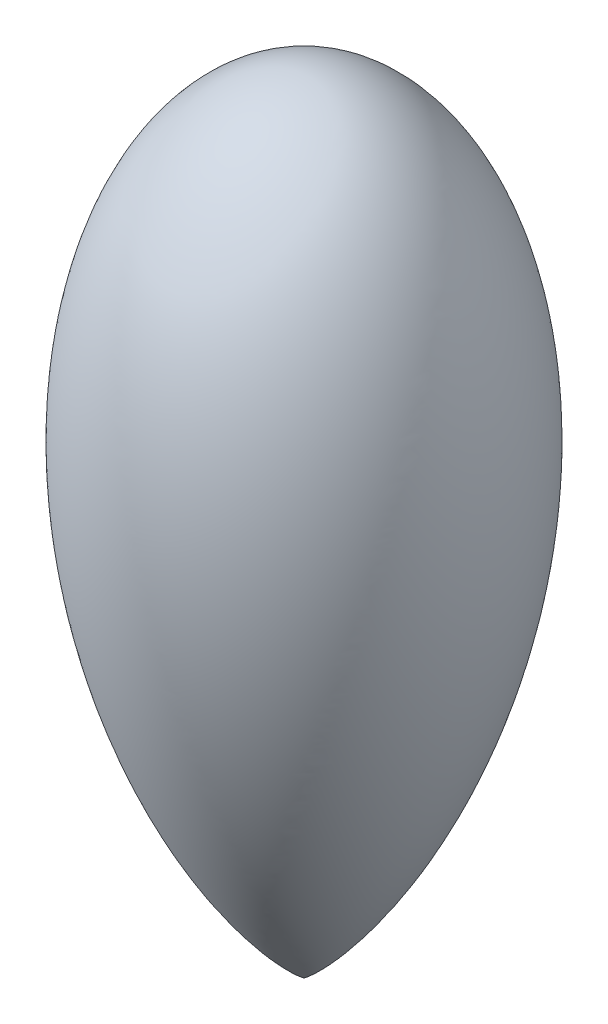
ISO-10303-21;
HEADER;
FILE_DESCRIPTION(('STEP AP214'),'2;1');
FILE_NAME('part.step','',(''),(''),'','','');
FILE_SCHEMA(('AUTOMOTIVE_DESIGN { 1 0 10303 214 1 1 1 1 }'));
ENDSEC;
DATA;
#1=APPLICATION_CONTEXT('core data for automotive mechanical design processes');
#2=APPLICATION_PROTOCOL_DEFINITION('international standard','automotive_design',2000,#1);
#3=PRODUCT_CONTEXT('',#1,'mechanical');
#4=PRODUCT('Part','Part','',(#3));
#5=PRODUCT_RELATED_PRODUCT_CATEGORY('part','',(#4));
#6=PRODUCT_DEFINITION_FORMATION('','',#4);
#7=PRODUCT_DEFINITION_CONTEXT('part definition',#1,'design');
#8=PRODUCT_DEFINITION('design','',#6,#7);
#9=PRODUCT_DEFINITION_SHAPE('','',#8);
#10=(LENGTH_UNIT() NAMED_UNIT(*) SI_UNIT(.MILLI.,.METRE.));
#11=(NAMED_UNIT(*) PLANE_ANGLE_UNIT() SI_UNIT($,.RADIAN.));
#12=(NAMED_UNIT(*) SI_UNIT($,.STERADIAN.) SOLID_ANGLE_UNIT());
#13=UNCERTAINTY_MEASURE_WITH_UNIT(LENGTH_MEASURE(1.E-05),#10,'distance_accuracy_value','');
#14=(GEOMETRIC_REPRESENTATION_CONTEXT(3) GLOBAL_UNCERTAINTY_ASSIGNED_CONTEXT((#13)) GLOBAL_UNIT_ASSIGNED_CONTEXT((#10,
#11,#12)) REPRESENTATION_CONTEXT('',''));
#15=CARTESIAN_POINT('',(0.,0.,0.));
#16=DIRECTION('',(0.,0.,1.));
#17=DIRECTION('',(1.,0.,0.));
#18=AXIS2_PLACEMENT_3D('',#15,#16,#17);
#19=CARTESIAN_POINT('',(-2.02926264296774E-10,0.,0.));
#20=CARTESIAN_POINT('',(0.0717853702311734,0.0518540831576657,0.));
#21=CARTESIAN_POINT('',(0.214574658402708,0.156617176103664,0.));
#22=CARTESIAN_POINT('',(0.496950104184648,0.370472015656567,0.));
#23=CARTESIAN_POINT('',(1.05480117848832,0.807143191290645,0.));
#24=CARTESIAN_POINT('',(1.80993147111071,1.42253628754725,0.));
#25=CARTESIAN_POINT('',(2.75517558960353,2.22478092115772,0.));
#26=CARTESIAN_POINT('',(3.8179713715169,3.16179624411655,0.));
#27=CARTESIAN_POINT('',(4.86569385934361,4.11560903109981,0.));
#28=CARTESIAN_POINT('',(6.15846404705854,5.32614344579271,0.));
#29=CARTESIAN_POINT('',(7.73540123757646,6.85358925528498,0.));
#30=CARTESIAN_POINT('',(9.58158547287812,8.7122951681977,0.));
#31=CARTESIAN_POINT('',(11.6812615677432,10.9162868547804,0.));
#32=CARTESIAN_POINT('',(13.7853327582307,13.2120301004228,0.));
#33=CARTESIAN_POINT('',(16.3642335694762,16.1277597760601,0.));
#34=CARTESIAN_POINT('',(19.3817550662069,19.6936952107332,0.));
#35=CARTESIAN_POINT('',(22.9872803470232,24.175892530292,0.));
#36=CARTESIAN_POINT('',(27.1151224994141,29.6215039572647,0.));
#37=CARTESIAN_POINT('',(31.264471127031,35.4266337046961,0.));
#38=CARTESIAN_POINT('',(35.421520285346,41.5942284832149,0.));
#39=CARTESIAN_POINT('',(40.4166553362054,49.4354410446972,0.));
#40=CARTESIAN_POINT('',(46.1001905212503,59.0372397139515,0.));
#41=CARTESIAN_POINT('',(52.2970359402469,70.4866573089005,0.));
#42=CARTESIAN_POINT('',(58.806049892909,83.8654816794686,0.));
#43=CARTESIAN_POINT('',(64.7556363946668,97.5019901994042,0.));
#44=CARTESIAN_POINT('',(70.1533065932443,111.365996188055,0.));
#45=CARTESIAN_POINT('',(76.2138237634696,128.947781241798,0.));
#46=CARTESIAN_POINT('',(82.3851329356026,150.401479659337,0.));
#47=CARTESIAN_POINT('',(87.9565612696462,175.85445307802,0.));
#48=CARTESIAN_POINT('',(91.4893188724422,201.671593696003,0.));
#49=CARTESIAN_POINT('',(92.9633174753603,223.95019677703,0.));
#50=CARTESIAN_POINT('',(93.0831763057516,242.548610516012,0.));
#51=CARTESIAN_POINT('',(92.4788453526525,257.415887104169,0.));
#52=CARTESIAN_POINT('',(91.1324436504385,272.235269983792,0.));
#53=CARTESIAN_POINT('',(89.2609362308563,285.121341877209,0.));
#54=CARTESIAN_POINT('',(87.1237346026261,296.074187207267,0.));
#55=CARTESIAN_POINT('',(84.9645651868758,305.117720973332,0.));
#56=CARTESIAN_POINT('',(83.0002977932717,312.291991964506,0.));
#57=CARTESIAN_POINT('',(80.7880905592931,319.393915411633,0.));
#58=CARTESIAN_POINT('',(78.3158651569219,326.40978055237,0.));
#59=CARTESIAN_POINT('',(75.4437924694911,333.642399047453,0.));
#60=CARTESIAN_POINT('',(72.1115926642654,341.053624009429,0.));
#61=CARTESIAN_POINT('',(68.4055952646716,348.286566977112,0.));
#62=CARTESIAN_POINT('',(64.3010869279958,355.301256014537,0.));
#63=CARTESIAN_POINT('',(59.9872350366763,361.780670335443,0.));
#64=CARTESIAN_POINT('',(56.0614775939341,366.975711237159,0.));
#65=CARTESIAN_POINT('',(52.4587106026038,371.237111046211,0.));
#66=CARTESIAN_POINT('',(49.3094590246938,374.624260196504,0.));
#67=CARTESIAN_POINT('',(46.7122282427618,377.218856875807,0.));
#68=CARTESIAN_POINT('',(44.0347894297085,379.695399266055,0.));
#69=CARTESIAN_POINT('',(41.2785338232118,382.047149864307,0.));
#70=CARTESIAN_POINT('',(38.1625972451684,384.486727713384,0.));
#71=CARTESIAN_POINT('',(34.6557692879765,386.961468043147,0.));
#72=CARTESIAN_POINT('',(31.2523742071326,389.076715526544,0.));
#73=CARTESIAN_POINT('',(27.9857313781815,390.856962272368,0.));
#74=CARTESIAN_POINT('',(25.1964673558402,392.208298173918,0.));
#75=CARTESIAN_POINT('',(22.9266102876851,393.206259600711,0.));
#76=CARTESIAN_POINT('',(20.6205165479357,394.117367992805,0.));
#77=CARTESIAN_POINT('',(18.2806101065425,394.937999998564,0.));
#78=CARTESIAN_POINT('',(15.9099174966696,395.664697670681,0.));
#79=CARTESIAN_POINT('',(13.8111999527839,396.215547727999,0.));
#80=CARTESIAN_POINT('',(11.9975059985246,396.625156484187,0.));
#81=CARTESIAN_POINT('',(10.4768620296561,396.923999318133,0.));
#82=CARTESIAN_POINT('',(9.25630032529253,397.137281541315,0.));
#83=CARTESIAN_POINT('',(8.02997363430822,397.3245058938,0.));
#84=CARTESIAN_POINT('',(6.80259090209571,397.485435788982,0.));
#85=CARTESIAN_POINT('',(5.56743954570694,397.61986545504,0.));
#86=CARTESIAN_POINT('',(4.33762084541527,397.727621056107,0.));
#87=CARTESIAN_POINT('',(3.24680366679615,397.798444416699,0.));
#88=CARTESIAN_POINT('',(2.33173009735351,397.842324596822,0.));
#89=CARTESIAN_POINT('',(1.53514869391872,397.867652102055,0.));
#90=CARTESIAN_POINT('',(0.960353225409776,397.881163829733,0.));
#91=CARTESIAN_POINT('',(0.428381043301095,397.886231566278,0.));
#92=CARTESIAN_POINT('',(0.142763625402348,397.88735772974,0.));
#93=CARTESIAN_POINT('',(-3.04535525334229E-10,397.887357729738,0.));
#94=B_SPLINE_CURVE_WITH_KNOTS('',4,(#19,#20,#21,#22,#23,#24,#25,#26,#27,#28,#29,#30,#31,#32,#33,
#34,#35,#36,#37,#38,#39,#40,#41,#42,#43,#44,#45,#46,#47,#48,#49,#50,#51,#52,#53,#54,#55,#56,#57,
#58,#59,#60,#61,#62,#63,#64,#65,#66,#67,#68,#69,#70,#71,#72,#73,#74,#75,#76,#77,#78,#79,#80,#81,
#82,#83,#84,#85,#86,#87,#88,#89,#90,#91,#92,#93),.UNSPECIFIED.,.F.,.F.,(5,1,1,1,1,1,1,1,1,1,1,1,
1,1,1,1,1,1,1,1,1,1,1,1,1,1,1,1,1,1,1,1,1,1,1,1,1,1,1,1,1,1,1,1,1,1,1,1,1,1,1,1,1,1,1,1,1,1,1,1,
1,1,1,1,1,1,1,1,1,1,1,5),(0.0785531407388983,0.0792550485535816,0.079956956368265,
0.0813607719976317,0.0841684032563651,0.0869760345150985,0.0897836657738319,0.0925912970325653,
0.0953989282912987,0.101014190808766,0.107184924739465,0.113355658670164,0.119526392600863,
0.125697126531563,0.138038594392961,0.15038006225436,0.165117482510547,0.179854902766735,
0.194592323022922,0.209329743279109,0.238804534996939,0.268279326714769,0.297754183049797,
0.327229039384825,0.356703990155851,0.386178940926877,0.445128621571967,0.504078336541666,
0.563028074141747,0.592502931402398,0.621977788663049,0.651452642205887,0.680927495748725,
0.710402349098714,0.725139775773709,0.739877202448704,0.75461467518413,0.769352147919556,
0.784089620654982,0.798827093390408,0.816283082191479,0.83373907099255,0.848476619588147,
0.863214168183744,0.877951515453782,0.885320189088802,0.892688862723821,0.899866839540109,
0.907044816356397,0.914222793172685,0.921400769988972,0.931225627062439,0.941050484135907,
0.945962955850604,0.9508754275653,0.955787899279997,0.960700370994694,0.965612835638806,
0.970525300282918,0.975437764927029,0.977893997249085,0.980350229571141,0.982806450874748,
0.985262672178356,0.987718893481963,0.990175114785571,0.992631336089178,0.995087557392785,
0.996315668044589,0.997543778696393,0.998771889348196,1.),.UNSPECIFIED.);
#95=CARTESIAN_POINT('',(-2.03023718592587E-10,397.887357729738,0.));
#96=DIRECTION('',(0.,1.,0.));
#97=AXIS1_PLACEMENT('',#95,#96);
#98=SURFACE_OF_REVOLUTION('',#94,#97);
#99=CARTESIAN_POINT('',(-2.03023718592587E-10,397.887357729738,0.));
#100=VERTEX_POINT('',#99);
#101=VERTEX_LOOP('',#100);
#102=FACE_BOUND('',#101,.T.);
#103=CARTESIAN_POINT('',(-2.0297499144468E-10,0.,0.));
#104=VERTEX_POINT('',#103);
#105=VERTEX_LOOP('',#104);
#106=FACE_BOUND('',#105,.T.);
#107=ADVANCED_FACE('F40',(#102,#106),#98,.T.);
#108=CLOSED_SHELL('',(#107));
#109=MANIFOLD_SOLID_BREP('B2',#108);
#110=ADVANCED_BREP_SHAPE_REPRESENTATION('',(#18,#109),#14);
#111=SHAPE_DEFINITION_REPRESENTATION(#9,#110);
ENDSEC;
END-ISO-10303-21;
